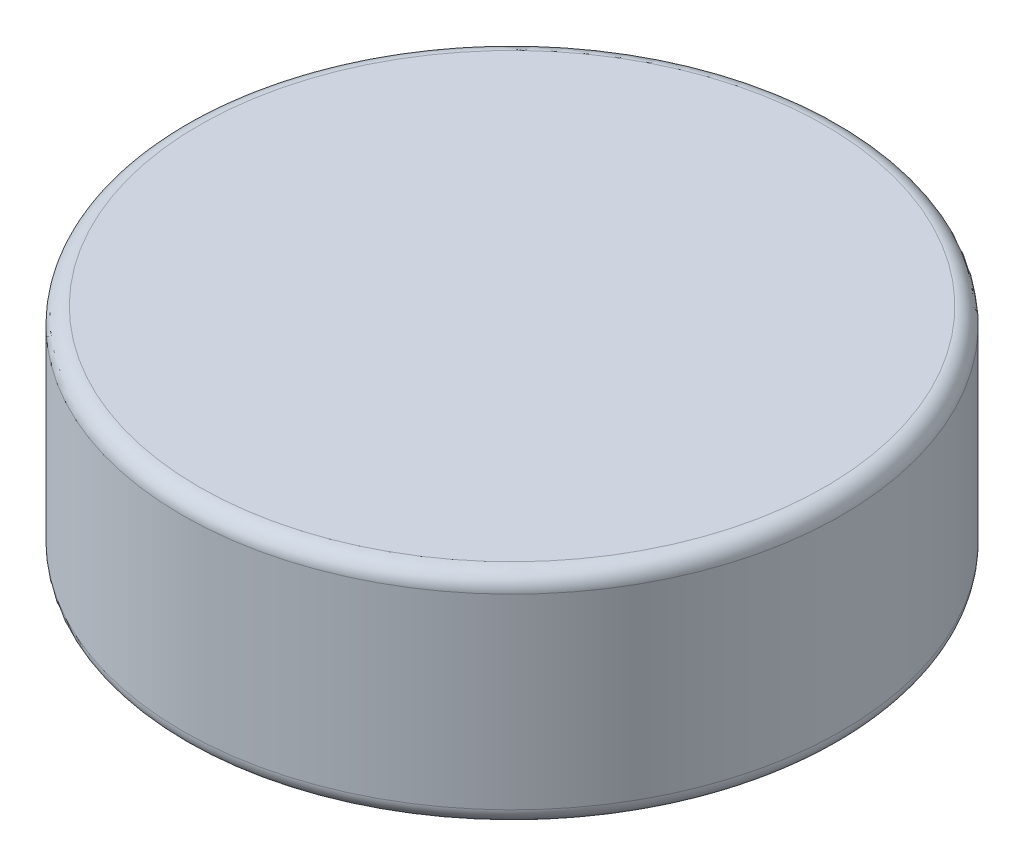
ISO-10303-21;
HEADER;
FILE_DESCRIPTION(('STEP AP214'),'2;1');
FILE_NAME('part.step','',(''),(''),'','','');
FILE_SCHEMA(('AUTOMOTIVE_DESIGN { 1 0 10303 214 1 1 1 1 }'));
ENDSEC;
DATA;
#1=APPLICATION_CONTEXT('core data for automotive mechanical design processes');
#2=APPLICATION_PROTOCOL_DEFINITION('international standard','automotive_design',2000,#1);
#3=PRODUCT_CONTEXT('',#1,'mechanical');
#4=PRODUCT('Part','Part','',(#3));
#5=PRODUCT_RELATED_PRODUCT_CATEGORY('part','',(#4));
#6=PRODUCT_DEFINITION_FORMATION('','',#4);
#7=PRODUCT_DEFINITION_CONTEXT('part definition',#1,'design');
#8=PRODUCT_DEFINITION('design','',#6,#7);
#9=PRODUCT_DEFINITION_SHAPE('','',#8);
#10=(LENGTH_UNIT() NAMED_UNIT(*) SI_UNIT(.MILLI.,.METRE.));
#11=(NAMED_UNIT(*) PLANE_ANGLE_UNIT() SI_UNIT($,.RADIAN.));
#12=(NAMED_UNIT(*) SI_UNIT($,.STERADIAN.) SOLID_ANGLE_UNIT());
#13=UNCERTAINTY_MEASURE_WITH_UNIT(LENGTH_MEASURE(1.E-05),#10,'distance_accuracy_value','');
#14=(GEOMETRIC_REPRESENTATION_CONTEXT(3) GLOBAL_UNCERTAINTY_ASSIGNED_CONTEXT((#13)) GLOBAL_UNIT_ASSIGNED_CONTEXT((#10,
#11,#12)) REPRESENTATION_CONTEXT('',''));
#15=CARTESIAN_POINT('',(0.,0.,0.));
#16=DIRECTION('',(0.,0.,1.));
#17=DIRECTION('',(1.,0.,0.));
#18=AXIS2_PLACEMENT_3D('',#15,#16,#17);
#19=CARTESIAN_POINT('',(0.,2.,0.));
#20=DIRECTION('',(0.,-1.,0.));
#21=DIRECTION('',(0.,0.,-1.));
#22=AXIS2_PLACEMENT_3D('',#19,#20,#21);
#23=CYLINDRICAL_SURFACE('',#22,3.);
#24=CARTESIAN_POINT('',(0.,0.15,0.));
#25=DIRECTION('',(0.,1.,0.));
#26=DIRECTION('',(0.,0.,1.));
#27=AXIS2_PLACEMENT_3D('',#24,#25,#26);
#28=CIRCLE('',#27,3.);
#29=CARTESIAN_POINT('',(0.,0.15,3.));
#30=VERTEX_POINT('',#29);
#31=EDGE_CURVE('E52',#30,#30,#28,.T.);
#32=ORIENTED_EDGE('',*,*,#31,.T.);
#33=EDGE_LOOP('',(#32));
#34=FACE_BOUND('',#33,.T.);
#35=CARTESIAN_POINT('',(0.,1.85,0.));
#36=DIRECTION('',(0.,1.,0.));
#37=DIRECTION('',(0.,0.,1.));
#38=AXIS2_PLACEMENT_3D('',#35,#36,#37);
#39=CIRCLE('',#38,3.);
#40=CARTESIAN_POINT('',(0.,1.85,3.));
#41=VERTEX_POINT('',#40);
#42=EDGE_CURVE('E57',#41,#41,#39,.F.);
#43=ORIENTED_EDGE('',*,*,#42,.T.);
#44=EDGE_LOOP('',(#43));
#45=FACE_BOUND('',#44,.T.);
#46=ADVANCED_FACE('F39',(#34,#45),#23,.T.);
#47=CARTESIAN_POINT('',(0.,2.,0.));
#48=DIRECTION('',(0.,1.,0.));
#49=DIRECTION('',(0.,0.,1.));
#50=AXIS2_PLACEMENT_3D('',#47,#48,#49);
#51=PLANE('',#50);
#52=CARTESIAN_POINT('',(0.,2.,0.));
#53=DIRECTION('',(0.,1.,0.));
#54=DIRECTION('',(0.,0.,1.));
#55=AXIS2_PLACEMENT_3D('',#52,#53,#54);
#56=CIRCLE('',#55,2.85);
#57=CARTESIAN_POINT('',(0.,2.,2.85));
#58=VERTEX_POINT('',#57);
#59=EDGE_CURVE('E10',#58,#58,#56,.T.);
#60=ORIENTED_EDGE('',*,*,#59,.T.);
#61=EDGE_LOOP('',(#60));
#62=FACE_BOUND('',#61,.T.);
#63=ADVANCED_FACE('F74',(#62),#51,.T.);
#64=CARTESIAN_POINT('',(0.,0.,0.));
#65=DIRECTION('',(0.,1.,0.));
#66=DIRECTION('',(0.,0.,1.));
#67=AXIS2_PLACEMENT_3D('',#64,#65,#66);
#68=PLANE('',#67);
#69=CARTESIAN_POINT('',(0.,0.,0.));
#70=DIRECTION('',(0.,1.,0.));
#71=DIRECTION('',(0.,0.,1.));
#72=AXIS2_PLACEMENT_3D('',#69,#70,#71);
#73=CIRCLE('',#72,2.85);
#74=CARTESIAN_POINT('',(0.,0.,2.85));
#75=VERTEX_POINT('',#74);
#76=EDGE_CURVE('E47',#75,#75,#73,.F.);
#77=ORIENTED_EDGE('',*,*,#76,.T.);
#78=EDGE_LOOP('',(#77));
#79=FACE_BOUND('',#78,.T.);
#80=ADVANCED_FACE('F71',(#79),#68,.F.);
#81=CARTESIAN_POINT('',(0.,0.15,0.));
#82=DIRECTION('',(0.,1.,0.));
#83=DIRECTION('',(0.,0.,1.));
#84=AXIS2_PLACEMENT_3D('',#81,#82,#83);
#85=TOROIDAL_SURFACE('',#84,2.85,0.15);
#86=ORIENTED_EDGE('',*,*,#76,.F.);
#87=EDGE_LOOP('',(#86));
#88=FACE_BOUND('',#87,.T.);
#89=ORIENTED_EDGE('',*,*,#31,.F.);
#90=EDGE_LOOP('',(#89));
#91=FACE_BOUND('',#90,.T.);
#92=ADVANCED_FACE('F67',(#88,#91),#85,.T.);
#93=CARTESIAN_POINT('',(0.,1.85,0.));
#94=DIRECTION('',(0.,1.,0.));
#95=DIRECTION('',(0.,0.,1.));
#96=AXIS2_PLACEMENT_3D('',#93,#94,#95);
#97=TOROIDAL_SURFACE('',#96,2.85,0.15);
#98=ORIENTED_EDGE('',*,*,#42,.F.);
#99=EDGE_LOOP('',(#98));
#100=FACE_BOUND('',#99,.T.);
#101=ORIENTED_EDGE('',*,*,#59,.F.);
#102=EDGE_LOOP('',(#101));
#103=FACE_BOUND('',#102,.T.);
#104=ADVANCED_FACE('F41',(#100,#103),#97,.T.);
#105=CLOSED_SHELL('',(#46,#63,#80,#92,#104));
#106=MANIFOLD_SOLID_BREP('B2',#105);
#107=ADVANCED_BREP_SHAPE_REPRESENTATION('',(#18,#106),#14);
#108=SHAPE_DEFINITION_REPRESENTATION(#9,#107);
ENDSEC;
END-ISO-10303-21;
